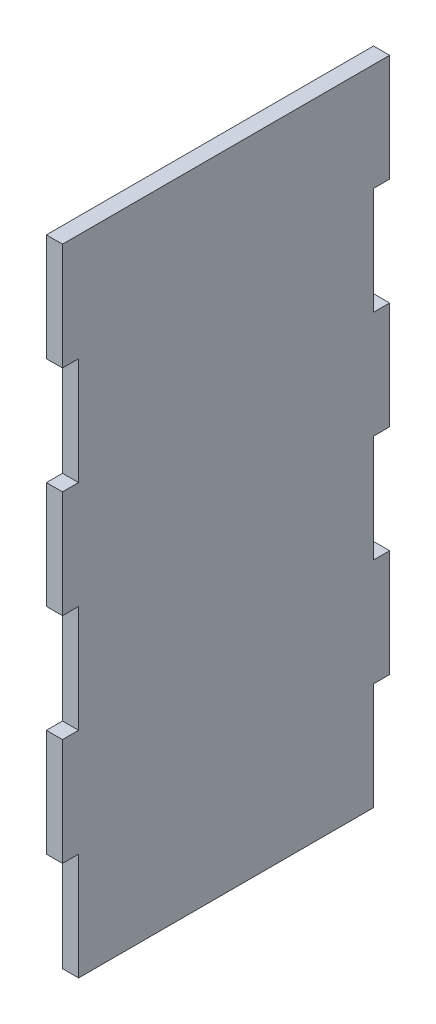
ISO-10303-21;
HEADER;
FILE_DESCRIPTION(('STEP AP214'),'2;1');
FILE_NAME('part.step','',(''),(''),'','','');
FILE_SCHEMA(('AUTOMOTIVE_DESIGN { 1 0 10303 214 1 1 1 1 }'));
ENDSEC;
DATA;
#1=APPLICATION_CONTEXT('core data for automotive mechanical design processes');
#2=APPLICATION_PROTOCOL_DEFINITION('international standard','automotive_design',2000,#1);
#3=PRODUCT_CONTEXT('',#1,'mechanical');
#4=PRODUCT('Part','Part','',(#3));
#5=PRODUCT_RELATED_PRODUCT_CATEGORY('part','',(#4));
#6=PRODUCT_DEFINITION_FORMATION('','',#4);
#7=PRODUCT_DEFINITION_CONTEXT('part definition',#1,'design');
#8=PRODUCT_DEFINITION('design','',#6,#7);
#9=PRODUCT_DEFINITION_SHAPE('','',#8);
#10=(LENGTH_UNIT() NAMED_UNIT(*) SI_UNIT(.MILLI.,.METRE.));
#11=(NAMED_UNIT(*) PLANE_ANGLE_UNIT() SI_UNIT($,.RADIAN.));
#12=(NAMED_UNIT(*) SI_UNIT($,.STERADIAN.) SOLID_ANGLE_UNIT());
#13=UNCERTAINTY_MEASURE_WITH_UNIT(LENGTH_MEASURE(1.E-05),#10,'distance_accuracy_value','');
#14=(GEOMETRIC_REPRESENTATION_CONTEXT(3) GLOBAL_UNCERTAINTY_ASSIGNED_CONTEXT((#13)) GLOBAL_UNIT_ASSIGNED_CONTEXT((#10,
#11,#12)) REPRESENTATION_CONTEXT('',''));
#15=CARTESIAN_POINT('',(0.,0.,0.));
#16=DIRECTION('',(0.,0.,1.));
#17=DIRECTION('',(1.,0.,0.));
#18=AXIS2_PLACEMENT_3D('',#15,#16,#17);
#19=CARTESIAN_POINT('',(3.,0.,-27.5));
#20=DIRECTION('',(0.,0.,1.));
#21=DIRECTION('',(1.,0.,0.));
#22=AXIS2_PLACEMENT_3D('',#19,#20,#21);
#23=PLANE('',#22);
#24=DIRECTION('',(0.,1.,0.));
#25=VECTOR('',#24,1.);
#26=CARTESIAN_POINT('',(0.,0.,-27.5));
#27=LINE('',#26,#25);
#28=CARTESIAN_POINT('',(0.,0.,-27.5));
#29=VERTEX_POINT('',#28);
#30=CARTESIAN_POINT('',(0.,20.,-27.5));
#31=VERTEX_POINT('',#30);
#32=EDGE_CURVE('E229',#29,#31,#27,.T.);
#33=ORIENTED_EDGE('',*,*,#32,.T.);
#34=DIRECTION('',(-1.,0.,0.));
#35=VECTOR('',#34,1.);
#36=CARTESIAN_POINT('',(3.,20.,-27.5));
#37=LINE('',#36,#35);
#38=CARTESIAN_POINT('',(3.,20.,-27.5));
#39=VERTEX_POINT('',#38);
#40=EDGE_CURVE('E11',#39,#31,#37,.T.);
#41=ORIENTED_EDGE('',*,*,#40,.F.);
#42=DIRECTION('',(0.,1.,0.));
#43=VECTOR('',#42,1.);
#44=CARTESIAN_POINT('',(3.,0.,-27.5));
#45=LINE('',#44,#43);
#46=CARTESIAN_POINT('',(3.,0.,-27.5));
#47=VERTEX_POINT('',#46);
#48=EDGE_CURVE('E275',#47,#39,#45,.T.);
#49=ORIENTED_EDGE('',*,*,#48,.F.);
#50=DIRECTION('',(-1.,0.,0.));
#51=VECTOR('',#50,1.);
#52=CARTESIAN_POINT('',(3.,0.,-27.5));
#53=LINE('',#52,#51);
#54=EDGE_CURVE('E225',#47,#29,#53,.T.);
#55=ORIENTED_EDGE('',*,*,#54,.T.);
#56=EDGE_LOOP('',(#33,#41,#49,#55));
#57=FACE_BOUND('',#56,.T.);
#58=ADVANCED_FACE('F37',(#57),#23,.F.);
#59=CARTESIAN_POINT('',(3.,20.,-27.5));
#60=DIRECTION('',(0.,1.,0.));
#61=DIRECTION('',(0.,0.,1.));
#62=AXIS2_PLACEMENT_3D('',#59,#60,#61);
#63=PLANE('',#62);
#64=DIRECTION('',(0.,0.,-1.));
#65=VECTOR('',#64,1.);
#66=CARTESIAN_POINT('',(0.,20.,-27.5));
#67=LINE('',#66,#65);
#68=CARTESIAN_POINT('',(0.,20.,-30.5));
#69=VERTEX_POINT('',#68);
#70=EDGE_CURVE('E232',#31,#69,#67,.T.);
#71=ORIENTED_EDGE('',*,*,#70,.T.);
#72=DIRECTION('',(-1.,0.,0.));
#73=VECTOR('',#72,1.);
#74=CARTESIAN_POINT('',(3.,20.,-30.5));
#75=LINE('',#74,#73);
#76=CARTESIAN_POINT('',(3.,20.,-30.5));
#77=VERTEX_POINT('',#76);
#78=EDGE_CURVE('E45',#77,#69,#75,.T.);
#79=ORIENTED_EDGE('',*,*,#78,.F.);
#80=DIRECTION('',(0.,0.,-1.));
#81=VECTOR('',#80,1.);
#82=CARTESIAN_POINT('',(3.,20.,-27.5));
#83=LINE('',#82,#81);
#84=EDGE_CURVE('E144',#39,#77,#83,.T.);
#85=ORIENTED_EDGE('',*,*,#84,.F.);
#86=ORIENTED_EDGE('',*,*,#40,.T.);
#87=EDGE_LOOP('',(#71,#79,#85,#86));
#88=FACE_BOUND('',#87,.T.);
#89=ADVANCED_FACE('F413',(#88),#63,.F.);
#90=CARTESIAN_POINT('',(3.,20.,-30.5));
#91=DIRECTION('',(0.,0.,1.));
#92=DIRECTION('',(1.,0.,0.));
#93=AXIS2_PLACEMENT_3D('',#90,#91,#92);
#94=PLANE('',#93);
#95=DIRECTION('',(0.,1.,0.));
#96=VECTOR('',#95,1.);
#97=CARTESIAN_POINT('',(0.,20.,-30.5));
#98=LINE('',#97,#96);
#99=CARTESIAN_POINT('',(0.,40.,-30.5));
#100=VERTEX_POINT('',#99);
#101=EDGE_CURVE('E234',#69,#100,#98,.T.);
#102=ORIENTED_EDGE('',*,*,#101,.T.);
#103=DIRECTION('',(-1.,0.,0.));
#104=VECTOR('',#103,1.);
#105=CARTESIAN_POINT('',(3.,40.,-30.5));
#106=LINE('',#105,#104);
#107=CARTESIAN_POINT('',(3.,40.,-30.5));
#108=VERTEX_POINT('',#107);
#109=EDGE_CURVE('E330',#108,#100,#106,.T.);
#110=ORIENTED_EDGE('',*,*,#109,.F.);
#111=DIRECTION('',(0.,1.,0.));
#112=VECTOR('',#111,1.);
#113=CARTESIAN_POINT('',(3.,20.,-30.5));
#114=LINE('',#113,#112);
#115=EDGE_CURVE('E338',#77,#108,#114,.T.);
#116=ORIENTED_EDGE('',*,*,#115,.F.);
#117=ORIENTED_EDGE('',*,*,#78,.T.);
#118=EDGE_LOOP('',(#102,#110,#116,#117));
#119=FACE_BOUND('',#118,.T.);
#120=ADVANCED_FACE('F336',(#119),#94,.F.);
#121=CARTESIAN_POINT('',(3.,40.,-30.5));
#122=DIRECTION('',(0.,-1.,0.));
#123=DIRECTION('',(0.,0.,-1.));
#124=AXIS2_PLACEMENT_3D('',#121,#122,#123);
#125=PLANE('',#124);
#126=DIRECTION('',(0.,0.,1.));
#127=VECTOR('',#126,1.);
#128=CARTESIAN_POINT('',(0.,40.,-30.5));
#129=LINE('',#128,#127);
#130=CARTESIAN_POINT('',(0.,40.,-27.5));
#131=VERTEX_POINT('',#130);
#132=EDGE_CURVE('E236',#100,#131,#129,.T.);
#133=ORIENTED_EDGE('',*,*,#132,.T.);
#134=DIRECTION('',(-1.,0.,0.));
#135=VECTOR('',#134,1.);
#136=CARTESIAN_POINT('',(3.,40.,-27.5));
#137=LINE('',#136,#135);
#138=CARTESIAN_POINT('',(3.,40.,-27.5));
#139=VERTEX_POINT('',#138);
#140=EDGE_CURVE('E327',#139,#131,#137,.T.);
#141=ORIENTED_EDGE('',*,*,#140,.F.);
#142=DIRECTION('',(0.,0.,1.));
#143=VECTOR('',#142,1.);
#144=CARTESIAN_POINT('',(3.,40.,-30.5));
#145=LINE('',#144,#143);
#146=EDGE_CURVE('E356',#108,#139,#145,.T.);
#147=ORIENTED_EDGE('',*,*,#146,.F.);
#148=ORIENTED_EDGE('',*,*,#109,.T.);
#149=EDGE_LOOP('',(#133,#141,#147,#148));
#150=FACE_BOUND('',#149,.T.);
#151=ADVANCED_FACE('F347',(#150),#125,.F.);
#152=CARTESIAN_POINT('',(3.,40.,-27.5));
#153=DIRECTION('',(0.,0.,1.));
#154=DIRECTION('',(1.,0.,0.));
#155=AXIS2_PLACEMENT_3D('',#152,#153,#154);
#156=PLANE('',#155);
#157=DIRECTION('',(0.,1.,0.));
#158=VECTOR('',#157,1.);
#159=CARTESIAN_POINT('',(0.,40.,-27.5));
#160=LINE('',#159,#158);
#161=CARTESIAN_POINT('',(0.,60.,-27.5));
#162=VERTEX_POINT('',#161);
#163=EDGE_CURVE('E238',#131,#162,#160,.T.);
#164=ORIENTED_EDGE('',*,*,#163,.T.);
#165=DIRECTION('',(-1.,0.,0.));
#166=VECTOR('',#165,1.);
#167=CARTESIAN_POINT('',(3.,60.,-27.5));
#168=LINE('',#167,#166);
#169=CARTESIAN_POINT('',(3.,60.,-27.5));
#170=VERTEX_POINT('',#169);
#171=EDGE_CURVE('E324',#170,#162,#168,.T.);
#172=ORIENTED_EDGE('',*,*,#171,.F.);
#173=DIRECTION('',(0.,1.,0.));
#174=VECTOR('',#173,1.);
#175=CARTESIAN_POINT('',(3.,40.,-27.5));
#176=LINE('',#175,#174);
#177=EDGE_CURVE('E353',#139,#170,#176,.T.);
#178=ORIENTED_EDGE('',*,*,#177,.F.);
#179=ORIENTED_EDGE('',*,*,#140,.T.);
#180=EDGE_LOOP('',(#164,#172,#178,#179));
#181=FACE_BOUND('',#180,.T.);
#182=ADVANCED_FACE('F351',(#181),#156,.F.);
#183=CARTESIAN_POINT('',(3.,60.,-27.5));
#184=DIRECTION('',(0.,1.,0.));
#185=DIRECTION('',(0.,0.,1.));
#186=AXIS2_PLACEMENT_3D('',#183,#184,#185);
#187=PLANE('',#186);
#188=DIRECTION('',(0.,0.,-1.));
#189=VECTOR('',#188,1.);
#190=CARTESIAN_POINT('',(0.,60.,-27.5));
#191=LINE('',#190,#189);
#192=CARTESIAN_POINT('',(0.,60.,-30.5));
#193=VERTEX_POINT('',#192);
#194=EDGE_CURVE('E240',#162,#193,#191,.T.);
#195=ORIENTED_EDGE('',*,*,#194,.T.);
#196=DIRECTION('',(-1.,0.,0.));
#197=VECTOR('',#196,1.);
#198=CARTESIAN_POINT('',(3.,60.,-30.5));
#199=LINE('',#198,#197);
#200=CARTESIAN_POINT('',(3.,60.,-30.5));
#201=VERTEX_POINT('',#200);
#202=EDGE_CURVE('E321',#201,#193,#199,.T.);
#203=ORIENTED_EDGE('',*,*,#202,.F.);
#204=DIRECTION('',(0.,0.,-1.));
#205=VECTOR('',#204,1.);
#206=CARTESIAN_POINT('',(3.,60.,-27.5));
#207=LINE('',#206,#205);
#208=EDGE_CURVE('E355',#170,#201,#207,.T.);
#209=ORIENTED_EDGE('',*,*,#208,.F.);
#210=ORIENTED_EDGE('',*,*,#171,.T.);
#211=EDGE_LOOP('',(#195,#203,#209,#210));
#212=FACE_BOUND('',#211,.T.);
#213=ADVANCED_FACE('F426',(#212),#187,.F.);
#214=CARTESIAN_POINT('',(3.,60.,-30.5));
#215=DIRECTION('',(0.,0.,1.));
#216=DIRECTION('',(1.,0.,0.));
#217=AXIS2_PLACEMENT_3D('',#214,#215,#216);
#218=PLANE('',#217);
#219=DIRECTION('',(0.,1.,0.));
#220=VECTOR('',#219,1.);
#221=CARTESIAN_POINT('',(0.,60.,-30.5));
#222=LINE('',#221,#220);
#223=CARTESIAN_POINT('',(0.,80.,-30.5));
#224=VERTEX_POINT('',#223);
#225=EDGE_CURVE('E242',#193,#224,#222,.T.);
#226=ORIENTED_EDGE('',*,*,#225,.T.);
#227=DIRECTION('',(-1.,0.,0.));
#228=VECTOR('',#227,1.);
#229=CARTESIAN_POINT('',(3.,80.,-30.5));
#230=LINE('',#229,#228);
#231=CARTESIAN_POINT('',(3.,80.,-30.5));
#232=VERTEX_POINT('',#231);
#233=EDGE_CURVE('E318',#232,#224,#230,.T.);
#234=ORIENTED_EDGE('',*,*,#233,.F.);
#235=DIRECTION('',(0.,1.,0.));
#236=VECTOR('',#235,1.);
#237=CARTESIAN_POINT('',(3.,60.,-30.5));
#238=LINE('',#237,#236);
#239=EDGE_CURVE('E358',#201,#232,#238,.T.);
#240=ORIENTED_EDGE('',*,*,#239,.F.);
#241=ORIENTED_EDGE('',*,*,#202,.T.);
#242=EDGE_LOOP('',(#226,#234,#240,#241));
#243=FACE_BOUND('',#242,.T.);
#244=ADVANCED_FACE('F429',(#243),#218,.F.);
#245=CARTESIAN_POINT('',(3.,80.,-30.5));
#246=DIRECTION('',(0.,-1.,0.));
#247=DIRECTION('',(0.,0.,-1.));
#248=AXIS2_PLACEMENT_3D('',#245,#246,#247);
#249=PLANE('',#248);
#250=DIRECTION('',(0.,0.,1.));
#251=VECTOR('',#250,1.);
#252=CARTESIAN_POINT('',(0.,80.,-30.5));
#253=LINE('',#252,#251);
#254=CARTESIAN_POINT('',(0.,80.,-27.5));
#255=VERTEX_POINT('',#254);
#256=EDGE_CURVE('E244',#224,#255,#253,.T.);
#257=ORIENTED_EDGE('',*,*,#256,.T.);
#258=DIRECTION('',(-1.,0.,0.));
#259=VECTOR('',#258,1.);
#260=CARTESIAN_POINT('',(3.,80.,-27.5));
#261=LINE('',#260,#259);
#262=CARTESIAN_POINT('',(3.,80.,-27.5));
#263=VERTEX_POINT('',#262);
#264=EDGE_CURVE('E315',#263,#255,#261,.T.);
#265=ORIENTED_EDGE('',*,*,#264,.F.);
#266=DIRECTION('',(0.,0.,1.));
#267=VECTOR('',#266,1.);
#268=CARTESIAN_POINT('',(3.,80.,-30.5));
#269=LINE('',#268,#267);
#270=EDGE_CURVE('E364',#232,#263,#269,.T.);
#271=ORIENTED_EDGE('',*,*,#270,.F.);
#272=ORIENTED_EDGE('',*,*,#233,.T.);
#273=EDGE_LOOP('',(#257,#265,#271,#272));
#274=FACE_BOUND('',#273,.T.);
#275=ADVANCED_FACE('F433',(#274),#249,.F.);
#276=CARTESIAN_POINT('',(3.,80.,-27.5));
#277=DIRECTION('',(0.,0.,1.));
#278=DIRECTION('',(1.,0.,0.));
#279=AXIS2_PLACEMENT_3D('',#276,#277,#278);
#280=PLANE('',#279);
#281=DIRECTION('',(0.,1.,0.));
#282=VECTOR('',#281,1.);
#283=CARTESIAN_POINT('',(0.,80.,-27.5));
#284=LINE('',#283,#282);
#285=CARTESIAN_POINT('',(0.,100.,-27.5));
#286=VERTEX_POINT('',#285);
#287=EDGE_CURVE('E246',#255,#286,#284,.T.);
#288=ORIENTED_EDGE('',*,*,#287,.T.);
#289=DIRECTION('',(-1.,0.,0.));
#290=VECTOR('',#289,1.);
#291=CARTESIAN_POINT('',(3.,100.,-27.5));
#292=LINE('',#291,#290);
#293=CARTESIAN_POINT('',(3.,100.,-27.5));
#294=VERTEX_POINT('',#293);
#295=EDGE_CURVE('E312',#294,#286,#292,.T.);
#296=ORIENTED_EDGE('',*,*,#295,.F.);
#297=DIRECTION('',(0.,1.,0.));
#298=VECTOR('',#297,1.);
#299=CARTESIAN_POINT('',(3.,80.,-27.5));
#300=LINE('',#299,#298);
#301=EDGE_CURVE('E366',#263,#294,#300,.T.);
#302=ORIENTED_EDGE('',*,*,#301,.F.);
#303=ORIENTED_EDGE('',*,*,#264,.T.);
#304=EDGE_LOOP('',(#288,#296,#302,#303));
#305=FACE_BOUND('',#304,.T.);
#306=ADVANCED_FACE('F437',(#305),#280,.F.);
#307=CARTESIAN_POINT('',(3.,100.,-27.5));
#308=DIRECTION('',(0.,1.,0.));
#309=DIRECTION('',(0.,0.,1.));
#310=AXIS2_PLACEMENT_3D('',#307,#308,#309);
#311=PLANE('',#310);
#312=DIRECTION('',(0.,0.,-1.));
#313=VECTOR('',#312,1.);
#314=CARTESIAN_POINT('',(0.,100.,-27.5));
#315=LINE('',#314,#313);
#316=CARTESIAN_POINT('',(0.,100.,-30.5));
#317=VERTEX_POINT('',#316);
#318=EDGE_CURVE('E248',#286,#317,#315,.T.);
#319=ORIENTED_EDGE('',*,*,#318,.T.);
#320=DIRECTION('',(-1.,0.,0.));
#321=VECTOR('',#320,1.);
#322=CARTESIAN_POINT('',(3.,100.,-30.5));
#323=LINE('',#322,#321);
#324=CARTESIAN_POINT('',(3.,100.,-30.5));
#325=VERTEX_POINT('',#324);
#326=EDGE_CURVE('E309',#325,#317,#323,.T.);
#327=ORIENTED_EDGE('',*,*,#326,.F.);
#328=DIRECTION('',(0.,0.,-1.));
#329=VECTOR('',#328,1.);
#330=CARTESIAN_POINT('',(3.,100.,-27.5));
#331=LINE('',#330,#329);
#332=EDGE_CURVE('E368',#294,#325,#331,.T.);
#333=ORIENTED_EDGE('',*,*,#332,.F.);
#334=ORIENTED_EDGE('',*,*,#295,.T.);
#335=EDGE_LOOP('',(#319,#327,#333,#334));
#336=FACE_BOUND('',#335,.T.);
#337=ADVANCED_FACE('F441',(#336),#311,.F.);
#338=CARTESIAN_POINT('',(3.,100.,-30.5));
#339=DIRECTION('',(0.,0.,1.));
#340=DIRECTION('',(1.,0.,0.));
#341=AXIS2_PLACEMENT_3D('',#338,#339,#340);
#342=PLANE('',#341);
#343=DIRECTION('',(0.,1.,0.));
#344=VECTOR('',#343,1.);
#345=CARTESIAN_POINT('',(0.,100.,-30.5));
#346=LINE('',#345,#344);
#347=CARTESIAN_POINT('',(0.,120.,-30.5));
#348=VERTEX_POINT('',#347);
#349=EDGE_CURVE('E250',#317,#348,#346,.T.);
#350=ORIENTED_EDGE('',*,*,#349,.T.);
#351=DIRECTION('',(-1.,0.,0.));
#352=VECTOR('',#351,1.);
#353=CARTESIAN_POINT('',(3.,120.,-30.5));
#354=LINE('',#353,#352);
#355=CARTESIAN_POINT('',(3.,120.,-30.5));
#356=VERTEX_POINT('',#355);
#357=EDGE_CURVE('E306',#356,#348,#354,.T.);
#358=ORIENTED_EDGE('',*,*,#357,.F.);
#359=DIRECTION('',(0.,1.,0.));
#360=VECTOR('',#359,1.);
#361=CARTESIAN_POINT('',(3.,100.,-30.5));
#362=LINE('',#361,#360);
#363=EDGE_CURVE('E370',#325,#356,#362,.T.);
#364=ORIENTED_EDGE('',*,*,#363,.F.);
#365=ORIENTED_EDGE('',*,*,#326,.T.);
#366=EDGE_LOOP('',(#350,#358,#364,#365));
#367=FACE_BOUND('',#366,.T.);
#368=ADVANCED_FACE('F445',(#367),#342,.F.);
#369=CARTESIAN_POINT('',(3.,120.,-30.5));
#370=DIRECTION('',(0.,-1.,0.));
#371=DIRECTION('',(0.,0.,-1.));
#372=AXIS2_PLACEMENT_3D('',#369,#370,#371);
#373=PLANE('',#372);
#374=DIRECTION('',(0.,0.,1.));
#375=VECTOR('',#374,1.);
#376=CARTESIAN_POINT('',(0.,120.,-30.5));
#377=LINE('',#376,#375);
#378=CARTESIAN_POINT('',(0.,120.,30.5));
#379=VERTEX_POINT('',#378);
#380=EDGE_CURVE('E252',#348,#379,#377,.T.);
#381=ORIENTED_EDGE('',*,*,#380,.T.);
#382=DIRECTION('',(-1.,0.,0.));
#383=VECTOR('',#382,1.);
#384=CARTESIAN_POINT('',(3.,120.,30.5));
#385=LINE('',#384,#383);
#386=CARTESIAN_POINT('',(3.,120.,30.5));
#387=VERTEX_POINT('',#386);
#388=EDGE_CURVE('E303',#387,#379,#385,.T.);
#389=ORIENTED_EDGE('',*,*,#388,.F.);
#390=DIRECTION('',(0.,0.,1.));
#391=VECTOR('',#390,1.);
#392=CARTESIAN_POINT('',(3.,120.,-30.5));
#393=LINE('',#392,#391);
#394=EDGE_CURVE('E372',#356,#387,#393,.T.);
#395=ORIENTED_EDGE('',*,*,#394,.F.);
#396=ORIENTED_EDGE('',*,*,#357,.T.);
#397=EDGE_LOOP('',(#381,#389,#395,#396));
#398=FACE_BOUND('',#397,.T.);
#399=ADVANCED_FACE('F449',(#398),#373,.F.);
#400=CARTESIAN_POINT('',(3.,100.,30.5));
#401=DIRECTION('',(0.,0.,-1.));
#402=DIRECTION('',(0.,1.,0.));
#403=AXIS2_PLACEMENT_3D('',#400,#401,#402);
#404=PLANE('',#403);
#405=DIRECTION('',(0.,-1.,0.));
#406=VECTOR('',#405,1.);
#407=CARTESIAN_POINT('',(0.,100.,30.5));
#408=LINE('',#407,#406);
#409=CARTESIAN_POINT('',(0.,100.,30.5));
#410=VERTEX_POINT('',#409);
#411=EDGE_CURVE('E254',#379,#410,#408,.T.);
#412=ORIENTED_EDGE('',*,*,#411,.T.);
#413=DIRECTION('',(-1.,0.,0.));
#414=VECTOR('',#413,1.);
#415=CARTESIAN_POINT('',(3.,100.,30.5));
#416=LINE('',#415,#414);
#417=CARTESIAN_POINT('',(3.,100.,30.5));
#418=VERTEX_POINT('',#417);
#419=EDGE_CURVE('E300',#418,#410,#416,.T.);
#420=ORIENTED_EDGE('',*,*,#419,.F.);
#421=DIRECTION('',(0.,-1.,0.));
#422=VECTOR('',#421,1.);
#423=CARTESIAN_POINT('',(3.,100.,30.5));
#424=LINE('',#423,#422);
#425=EDGE_CURVE('E374',#387,#418,#424,.T.);
#426=ORIENTED_EDGE('',*,*,#425,.F.);
#427=ORIENTED_EDGE('',*,*,#388,.T.);
#428=EDGE_LOOP('',(#412,#420,#426,#427));
#429=FACE_BOUND('',#428,.T.);
#430=ADVANCED_FACE('F453',(#429),#404,.F.);
#431=CARTESIAN_POINT('',(3.,100.,27.5));
#432=DIRECTION('',(0.,1.,0.));
#433=DIRECTION('',(0.,0.,1.));
#434=AXIS2_PLACEMENT_3D('',#431,#432,#433);
#435=PLANE('',#434);
#436=DIRECTION('',(0.,0.,-1.));
#437=VECTOR('',#436,1.);
#438=CARTESIAN_POINT('',(0.,100.,27.5));
#439=LINE('',#438,#437);
#440=CARTESIAN_POINT('',(0.,100.,27.5));
#441=VERTEX_POINT('',#440);
#442=EDGE_CURVE('E256',#410,#441,#439,.T.);
#443=ORIENTED_EDGE('',*,*,#442,.T.);
#444=DIRECTION('',(-1.,0.,0.));
#445=VECTOR('',#444,1.);
#446=CARTESIAN_POINT('',(3.,100.,27.5));
#447=LINE('',#446,#445);
#448=CARTESIAN_POINT('',(3.,100.,27.5));
#449=VERTEX_POINT('',#448);
#450=EDGE_CURVE('E297',#449,#441,#447,.T.);
#451=ORIENTED_EDGE('',*,*,#450,.F.);
#452=DIRECTION('',(0.,0.,-1.));
#453=VECTOR('',#452,1.);
#454=CARTESIAN_POINT('',(3.,100.,27.5));
#455=LINE('',#454,#453);
#456=EDGE_CURVE('E376',#418,#449,#455,.T.);
#457=ORIENTED_EDGE('',*,*,#456,.F.);
#458=ORIENTED_EDGE('',*,*,#419,.T.);
#459=EDGE_LOOP('',(#443,#451,#457,#458));
#460=FACE_BOUND('',#459,.T.);
#461=ADVANCED_FACE('F457',(#460),#435,.F.);
#462=CARTESIAN_POINT('',(3.,80.,27.5));
#463=DIRECTION('',(0.,0.,-1.));
#464=DIRECTION('',(-1.,0.,0.));
#465=AXIS2_PLACEMENT_3D('',#462,#463,#464);
#466=PLANE('',#465);
#467=DIRECTION('',(0.,-1.,0.));
#468=VECTOR('',#467,1.);
#469=CARTESIAN_POINT('',(0.,80.,27.5));
#470=LINE('',#469,#468);
#471=CARTESIAN_POINT('',(0.,80.,27.5));
#472=VERTEX_POINT('',#471);
#473=EDGE_CURVE('E258',#441,#472,#470,.T.);
#474=ORIENTED_EDGE('',*,*,#473,.T.);
#475=DIRECTION('',(-1.,0.,0.));
#476=VECTOR('',#475,1.);
#477=CARTESIAN_POINT('',(3.,80.,27.5));
#478=LINE('',#477,#476);
#479=CARTESIAN_POINT('',(3.,80.,27.5));
#480=VERTEX_POINT('',#479);
#481=EDGE_CURVE('E294',#480,#472,#478,.T.);
#482=ORIENTED_EDGE('',*,*,#481,.F.);
#483=DIRECTION('',(0.,-1.,0.));
#484=VECTOR('',#483,1.);
#485=CARTESIAN_POINT('',(3.,80.,27.5));
#486=LINE('',#485,#484);
#487=EDGE_CURVE('E378',#449,#480,#486,.T.);
#488=ORIENTED_EDGE('',*,*,#487,.F.);
#489=ORIENTED_EDGE('',*,*,#450,.T.);
#490=EDGE_LOOP('',(#474,#482,#488,#489));
#491=FACE_BOUND('',#490,.T.);
#492=ADVANCED_FACE('F461',(#491),#466,.F.);
#493=CARTESIAN_POINT('',(3.,80.,30.5));
#494=DIRECTION('',(0.,-1.,0.));
#495=DIRECTION('',(0.,0.,-1.));
#496=AXIS2_PLACEMENT_3D('',#493,#494,#495);
#497=PLANE('',#496);
#498=DIRECTION('',(0.,0.,1.));
#499=VECTOR('',#498,1.);
#500=CARTESIAN_POINT('',(0.,80.,30.5));
#501=LINE('',#500,#499);
#502=CARTESIAN_POINT('',(0.,80.,30.5));
#503=VERTEX_POINT('',#502);
#504=EDGE_CURVE('E260',#472,#503,#501,.T.);
#505=ORIENTED_EDGE('',*,*,#504,.T.);
#506=DIRECTION('',(-1.,0.,0.));
#507=VECTOR('',#506,1.);
#508=CARTESIAN_POINT('',(3.,80.,30.5));
#509=LINE('',#508,#507);
#510=CARTESIAN_POINT('',(3.,80.,30.5));
#511=VERTEX_POINT('',#510);
#512=EDGE_CURVE('E291',#511,#503,#509,.T.);
#513=ORIENTED_EDGE('',*,*,#512,.F.);
#514=DIRECTION('',(0.,0.,1.));
#515=VECTOR('',#514,1.);
#516=CARTESIAN_POINT('',(3.,80.,30.5));
#517=LINE('',#516,#515);
#518=EDGE_CURVE('E380',#480,#511,#517,.T.);
#519=ORIENTED_EDGE('',*,*,#518,.F.);
#520=ORIENTED_EDGE('',*,*,#481,.T.);
#521=EDGE_LOOP('',(#505,#513,#519,#520));
#522=FACE_BOUND('',#521,.T.);
#523=ADVANCED_FACE('F465',(#522),#497,.F.);
#524=CARTESIAN_POINT('',(3.,60.,30.5));
#525=DIRECTION('',(0.,0.,-1.));
#526=DIRECTION('',(0.,1.,0.));
#527=AXIS2_PLACEMENT_3D('',#524,#525,#526);
#528=PLANE('',#527);
#529=DIRECTION('',(0.,-1.,0.));
#530=VECTOR('',#529,1.);
#531=CARTESIAN_POINT('',(0.,60.,30.5));
#532=LINE('',#531,#530);
#533=CARTESIAN_POINT('',(0.,60.,30.5));
#534=VERTEX_POINT('',#533);
#535=EDGE_CURVE('E262',#503,#534,#532,.T.);
#536=ORIENTED_EDGE('',*,*,#535,.T.);
#537=DIRECTION('',(-1.,0.,0.));
#538=VECTOR('',#537,1.);
#539=CARTESIAN_POINT('',(3.,60.,30.5));
#540=LINE('',#539,#538);
#541=CARTESIAN_POINT('',(3.,60.,30.5));
#542=VERTEX_POINT('',#541);
#543=EDGE_CURVE('E288',#542,#534,#540,.T.);
#544=ORIENTED_EDGE('',*,*,#543,.F.);
#545=DIRECTION('',(0.,-1.,0.));
#546=VECTOR('',#545,1.);
#547=CARTESIAN_POINT('',(3.,60.,30.5));
#548=LINE('',#547,#546);
#549=EDGE_CURVE('E382',#511,#542,#548,.T.);
#550=ORIENTED_EDGE('',*,*,#549,.F.);
#551=ORIENTED_EDGE('',*,*,#512,.T.);
#552=EDGE_LOOP('',(#536,#544,#550,#551));
#553=FACE_BOUND('',#552,.T.);
#554=ADVANCED_FACE('F469',(#553),#528,.F.);
#555=CARTESIAN_POINT('',(3.,60.,27.5));
#556=DIRECTION('',(0.,1.,0.));
#557=DIRECTION('',(0.,0.,1.));
#558=AXIS2_PLACEMENT_3D('',#555,#556,#557);
#559=PLANE('',#558);
#560=DIRECTION('',(0.,0.,-1.));
#561=VECTOR('',#560,1.);
#562=CARTESIAN_POINT('',(0.,60.,27.5));
#563=LINE('',#562,#561);
#564=CARTESIAN_POINT('',(0.,60.,27.5));
#565=VERTEX_POINT('',#564);
#566=EDGE_CURVE('E264',#534,#565,#563,.T.);
#567=ORIENTED_EDGE('',*,*,#566,.T.);
#568=DIRECTION('',(-1.,0.,0.));
#569=VECTOR('',#568,1.);
#570=CARTESIAN_POINT('',(3.,60.,27.5));
#571=LINE('',#570,#569);
#572=CARTESIAN_POINT('',(3.,60.,27.5));
#573=VERTEX_POINT('',#572);
#574=EDGE_CURVE('E285',#573,#565,#571,.T.);
#575=ORIENTED_EDGE('',*,*,#574,.F.);
#576=DIRECTION('',(0.,0.,-1.));
#577=VECTOR('',#576,1.);
#578=CARTESIAN_POINT('',(3.,60.,27.5));
#579=LINE('',#578,#577);
#580=EDGE_CURVE('E384',#542,#573,#579,.T.);
#581=ORIENTED_EDGE('',*,*,#580,.F.);
#582=ORIENTED_EDGE('',*,*,#543,.T.);
#583=EDGE_LOOP('',(#567,#575,#581,#582));
#584=FACE_BOUND('',#583,.T.);
#585=ADVANCED_FACE('F473',(#584),#559,.F.);
#586=CARTESIAN_POINT('',(3.,40.,27.5));
#587=DIRECTION('',(0.,0.,-1.));
#588=DIRECTION('',(0.,1.,0.));
#589=AXIS2_PLACEMENT_3D('',#586,#587,#588);
#590=PLANE('',#589);
#591=DIRECTION('',(0.,-1.,0.));
#592=VECTOR('',#591,1.);
#593=CARTESIAN_POINT('',(0.,40.,27.5));
#594=LINE('',#593,#592);
#595=CARTESIAN_POINT('',(0.,40.,27.5));
#596=VERTEX_POINT('',#595);
#597=EDGE_CURVE('E266',#565,#596,#594,.T.);
#598=ORIENTED_EDGE('',*,*,#597,.T.);
#599=DIRECTION('',(-1.,0.,0.));
#600=VECTOR('',#599,1.);
#601=CARTESIAN_POINT('',(3.,40.,27.5));
#602=LINE('',#601,#600);
#603=CARTESIAN_POINT('',(3.,40.,27.5));
#604=VERTEX_POINT('',#603);
#605=EDGE_CURVE('E282',#604,#596,#602,.T.);
#606=ORIENTED_EDGE('',*,*,#605,.F.);
#607=DIRECTION('',(0.,-1.,0.));
#608=VECTOR('',#607,1.);
#609=CARTESIAN_POINT('',(3.,40.,27.5));
#610=LINE('',#609,#608);
#611=EDGE_CURVE('E386',#573,#604,#610,.T.);
#612=ORIENTED_EDGE('',*,*,#611,.F.);
#613=ORIENTED_EDGE('',*,*,#574,.T.);
#614=EDGE_LOOP('',(#598,#606,#612,#613));
#615=FACE_BOUND('',#614,.T.);
#616=ADVANCED_FACE('F477',(#615),#590,.F.);
#617=CARTESIAN_POINT('',(3.,40.,30.5));
#618=DIRECTION('',(0.,-1.,0.));
#619=DIRECTION('',(0.,0.,-1.));
#620=AXIS2_PLACEMENT_3D('',#617,#618,#619);
#621=PLANE('',#620);
#622=DIRECTION('',(0.,0.,1.));
#623=VECTOR('',#622,1.);
#624=CARTESIAN_POINT('',(0.,40.,30.5));
#625=LINE('',#624,#623);
#626=CARTESIAN_POINT('',(0.,40.,30.5));
#627=VERTEX_POINT('',#626);
#628=EDGE_CURVE('E268',#596,#627,#625,.T.);
#629=ORIENTED_EDGE('',*,*,#628,.T.);
#630=DIRECTION('',(-1.,0.,0.));
#631=VECTOR('',#630,1.);
#632=CARTESIAN_POINT('',(3.,40.,30.5));
#633=LINE('',#632,#631);
#634=CARTESIAN_POINT('',(3.,40.,30.5));
#635=VERTEX_POINT('',#634);
#636=EDGE_CURVE('E279',#635,#627,#633,.T.);
#637=ORIENTED_EDGE('',*,*,#636,.F.);
#638=DIRECTION('',(0.,0.,1.));
#639=VECTOR('',#638,1.);
#640=CARTESIAN_POINT('',(3.,40.,30.5));
#641=LINE('',#640,#639);
#642=EDGE_CURVE('E388',#604,#635,#641,.T.);
#643=ORIENTED_EDGE('',*,*,#642,.F.);
#644=ORIENTED_EDGE('',*,*,#605,.T.);
#645=EDGE_LOOP('',(#629,#637,#643,#644));
#646=FACE_BOUND('',#645,.T.);
#647=ADVANCED_FACE('F394',(#646),#621,.F.);
#648=CARTESIAN_POINT('',(3.,20.,30.5));
#649=DIRECTION('',(0.,0.,-1.));
#650=DIRECTION('',(-1.,0.,0.));
#651=AXIS2_PLACEMENT_3D('',#648,#649,#650);
#652=PLANE('',#651);
#653=DIRECTION('',(0.,-1.,0.));
#654=VECTOR('',#653,1.);
#655=CARTESIAN_POINT('',(0.,20.,30.5));
#656=LINE('',#655,#654);
#657=CARTESIAN_POINT('',(0.,20.,30.5));
#658=VERTEX_POINT('',#657);
#659=EDGE_CURVE('E270',#627,#658,#656,.T.);
#660=ORIENTED_EDGE('',*,*,#659,.T.);
#661=DIRECTION('',(-1.,0.,0.));
#662=VECTOR('',#661,1.);
#663=CARTESIAN_POINT('',(3.,20.,30.5));
#664=LINE('',#663,#662);
#665=CARTESIAN_POINT('',(3.,20.,30.5));
#666=VERTEX_POINT('',#665);
#667=EDGE_CURVE('E220',#666,#658,#664,.T.);
#668=ORIENTED_EDGE('',*,*,#667,.F.);
#669=DIRECTION('',(0.,-1.,0.));
#670=VECTOR('',#669,1.);
#671=CARTESIAN_POINT('',(3.,20.,30.5));
#672=LINE('',#671,#670);
#673=EDGE_CURVE('E211',#635,#666,#672,.T.);
#674=ORIENTED_EDGE('',*,*,#673,.F.);
#675=ORIENTED_EDGE('',*,*,#636,.T.);
#676=EDGE_LOOP('',(#660,#668,#674,#675));
#677=FACE_BOUND('',#676,.T.);
#678=ADVANCED_FACE('F398',(#677),#652,.F.);
#679=CARTESIAN_POINT('',(3.,20.,27.5));
#680=DIRECTION('',(0.,1.,0.));
#681=DIRECTION('',(0.,0.,1.));
#682=AXIS2_PLACEMENT_3D('',#679,#680,#681);
#683=PLANE('',#682);
#684=DIRECTION('',(0.,0.,-1.));
#685=VECTOR('',#684,1.);
#686=CARTESIAN_POINT('',(0.,20.,27.5));
#687=LINE('',#686,#685);
#688=CARTESIAN_POINT('',(0.,20.,27.5));
#689=VERTEX_POINT('',#688);
#690=EDGE_CURVE('E219',#658,#689,#687,.T.);
#691=ORIENTED_EDGE('',*,*,#690,.T.);
#692=DIRECTION('',(-1.,0.,0.));
#693=VECTOR('',#692,1.);
#694=CARTESIAN_POINT('',(3.,20.,27.5));
#695=LINE('',#694,#693);
#696=CARTESIAN_POINT('',(3.,20.,27.5));
#697=VERTEX_POINT('',#696);
#698=EDGE_CURVE('E216',#697,#689,#695,.T.);
#699=ORIENTED_EDGE('',*,*,#698,.F.);
#700=DIRECTION('',(0.,0.,-1.));
#701=VECTOR('',#700,1.);
#702=CARTESIAN_POINT('',(3.,20.,27.5));
#703=LINE('',#702,#701);
#704=EDGE_CURVE('E205',#666,#697,#703,.T.);
#705=ORIENTED_EDGE('',*,*,#704,.F.);
#706=ORIENTED_EDGE('',*,*,#667,.T.);
#707=EDGE_LOOP('',(#691,#699,#705,#706));
#708=FACE_BOUND('',#707,.T.);
#709=ADVANCED_FACE('F217',(#708),#683,.F.);
#710=CARTESIAN_POINT('',(3.,0.,27.5));
#711=DIRECTION('',(0.,0.,-1.));
#712=DIRECTION('',(0.,1.,0.));
#713=AXIS2_PLACEMENT_3D('',#710,#711,#712);
#714=PLANE('',#713);
#715=DIRECTION('',(0.,-1.,0.));
#716=VECTOR('',#715,1.);
#717=CARTESIAN_POINT('',(0.,0.,27.5));
#718=LINE('',#717,#716);
#719=CARTESIAN_POINT('',(0.,0.,27.5));
#720=VERTEX_POINT('',#719);
#721=EDGE_CURVE('E130',#689,#720,#718,.T.);
#722=ORIENTED_EDGE('',*,*,#721,.T.);
#723=DIRECTION('',(-1.,0.,0.));
#724=VECTOR('',#723,1.);
#725=CARTESIAN_POINT('',(3.,0.,27.5));
#726=LINE('',#725,#724);
#727=CARTESIAN_POINT('',(3.,0.,27.5));
#728=VERTEX_POINT('',#727);
#729=EDGE_CURVE('E221',#728,#720,#726,.T.);
#730=ORIENTED_EDGE('',*,*,#729,.F.);
#731=DIRECTION('',(0.,-1.,0.));
#732=VECTOR('',#731,1.);
#733=CARTESIAN_POINT('',(3.,0.,27.5));
#734=LINE('',#733,#732);
#735=EDGE_CURVE('E209',#697,#728,#734,.T.);
#736=ORIENTED_EDGE('',*,*,#735,.F.);
#737=ORIENTED_EDGE('',*,*,#698,.T.);
#738=EDGE_LOOP('',(#722,#730,#736,#737));
#739=FACE_BOUND('',#738,.T.);
#740=ADVANCED_FACE('F223',(#739),#714,.F.);
#741=CARTESIAN_POINT('',(3.,0.,27.5));
#742=DIRECTION('',(0.,1.,0.));
#743=DIRECTION('',(0.,0.,1.));
#744=AXIS2_PLACEMENT_3D('',#741,#742,#743);
#745=PLANE('',#744);
#746=DIRECTION('',(0.,0.,-1.));
#747=VECTOR('',#746,1.);
#748=CARTESIAN_POINT('',(0.,0.,27.5));
#749=LINE('',#748,#747);
#750=EDGE_CURVE('E136',#720,#29,#749,.T.);
#751=ORIENTED_EDGE('',*,*,#750,.T.);
#752=ORIENTED_EDGE('',*,*,#54,.F.);
#753=DIRECTION('',(0.,0.,-1.));
#754=VECTOR('',#753,1.);
#755=CARTESIAN_POINT('',(3.,0.,27.5));
#756=LINE('',#755,#754);
#757=EDGE_CURVE('E53',#728,#47,#756,.T.);
#758=ORIENTED_EDGE('',*,*,#757,.F.);
#759=ORIENTED_EDGE('',*,*,#729,.T.);
#760=EDGE_LOOP('',(#751,#752,#758,#759));
#761=FACE_BOUND('',#760,.T.);
#762=ADVANCED_FACE('F402',(#761),#745,.F.);
#763=CARTESIAN_POINT('',(3.,0.,0.));
#764=DIRECTION('',(-1.,0.,0.));
#765=DIRECTION('',(0.,0.,1.));
#766=AXIS2_PLACEMENT_3D('',#763,#764,#765);
#767=PLANE('',#766);
#768=ORIENTED_EDGE('',*,*,#48,.T.);
#769=ORIENTED_EDGE('',*,*,#84,.T.);
#770=ORIENTED_EDGE('',*,*,#115,.T.);
#771=ORIENTED_EDGE('',*,*,#146,.T.);
#772=ORIENTED_EDGE('',*,*,#177,.T.);
#773=ORIENTED_EDGE('',*,*,#208,.T.);
#774=ORIENTED_EDGE('',*,*,#239,.T.);
#775=ORIENTED_EDGE('',*,*,#270,.T.);
#776=ORIENTED_EDGE('',*,*,#301,.T.);
#777=ORIENTED_EDGE('',*,*,#332,.T.);
#778=ORIENTED_EDGE('',*,*,#363,.T.);
#779=ORIENTED_EDGE('',*,*,#394,.T.);
#780=ORIENTED_EDGE('',*,*,#425,.T.);
#781=ORIENTED_EDGE('',*,*,#456,.T.);
#782=ORIENTED_EDGE('',*,*,#487,.T.);
#783=ORIENTED_EDGE('',*,*,#518,.T.);
#784=ORIENTED_EDGE('',*,*,#549,.T.);
#785=ORIENTED_EDGE('',*,*,#580,.T.);
#786=ORIENTED_EDGE('',*,*,#611,.T.);
#787=ORIENTED_EDGE('',*,*,#642,.T.);
#788=ORIENTED_EDGE('',*,*,#673,.T.);
#789=ORIENTED_EDGE('',*,*,#704,.T.);
#790=ORIENTED_EDGE('',*,*,#735,.T.);
#791=ORIENTED_EDGE('',*,*,#757,.T.);
#792=EDGE_LOOP('',(#768,#769,#770,#771,#772,#773,#774,#775,#776,#777,#778,#779,#780,#781,#782,
#783,#784,#785,#786,#787,#788,#789,#790,#791));
#793=FACE_BOUND('',#792,.T.);
#794=ADVANCED_FACE('F207',(#793),#767,.F.);
#795=CARTESIAN_POINT('',(0.,0.,0.));
#796=DIRECTION('',(-1.,0.,0.));
#797=DIRECTION('',(0.,0.,1.));
#798=AXIS2_PLACEMENT_3D('',#795,#796,#797);
#799=PLANE('',#798);
#800=ORIENTED_EDGE('',*,*,#32,.F.);
#801=ORIENTED_EDGE('',*,*,#750,.F.);
#802=ORIENTED_EDGE('',*,*,#721,.F.);
#803=ORIENTED_EDGE('',*,*,#690,.F.);
#804=ORIENTED_EDGE('',*,*,#659,.F.);
#805=ORIENTED_EDGE('',*,*,#628,.F.);
#806=ORIENTED_EDGE('',*,*,#597,.F.);
#807=ORIENTED_EDGE('',*,*,#566,.F.);
#808=ORIENTED_EDGE('',*,*,#535,.F.);
#809=ORIENTED_EDGE('',*,*,#504,.F.);
#810=ORIENTED_EDGE('',*,*,#473,.F.);
#811=ORIENTED_EDGE('',*,*,#442,.F.);
#812=ORIENTED_EDGE('',*,*,#411,.F.);
#813=ORIENTED_EDGE('',*,*,#380,.F.);
#814=ORIENTED_EDGE('',*,*,#349,.F.);
#815=ORIENTED_EDGE('',*,*,#318,.F.);
#816=ORIENTED_EDGE('',*,*,#287,.F.);
#817=ORIENTED_EDGE('',*,*,#256,.F.);
#818=ORIENTED_EDGE('',*,*,#225,.F.);
#819=ORIENTED_EDGE('',*,*,#194,.F.);
#820=ORIENTED_EDGE('',*,*,#163,.F.);
#821=ORIENTED_EDGE('',*,*,#132,.F.);
#822=ORIENTED_EDGE('',*,*,#101,.F.);
#823=ORIENTED_EDGE('',*,*,#70,.F.);
#824=EDGE_LOOP('',(#800,#801,#802,#803,#804,#805,#806,#807,#808,#809,#810,#811,#812,#813,#814,
#815,#816,#817,#818,#819,#820,#821,#822,#823));
#825=FACE_BOUND('',#824,.T.);
#826=ADVANCED_FACE('F342',(#825),#799,.T.);
#827=CLOSED_SHELL('',(#58,#89,#120,#151,#182,#213,#244,#275,#306,#337,#368,#399,#430,#461,#492,
#523,#554,#585,#616,#647,#678,#709,#740,#762,#794,#826));
#828=MANIFOLD_SOLID_BREP('B2',#827);
#829=ADVANCED_BREP_SHAPE_REPRESENTATION('',(#18,#828),#14);
#830=SHAPE_DEFINITION_REPRESENTATION(#9,#829);
ENDSEC;
END-ISO-10303-21;
